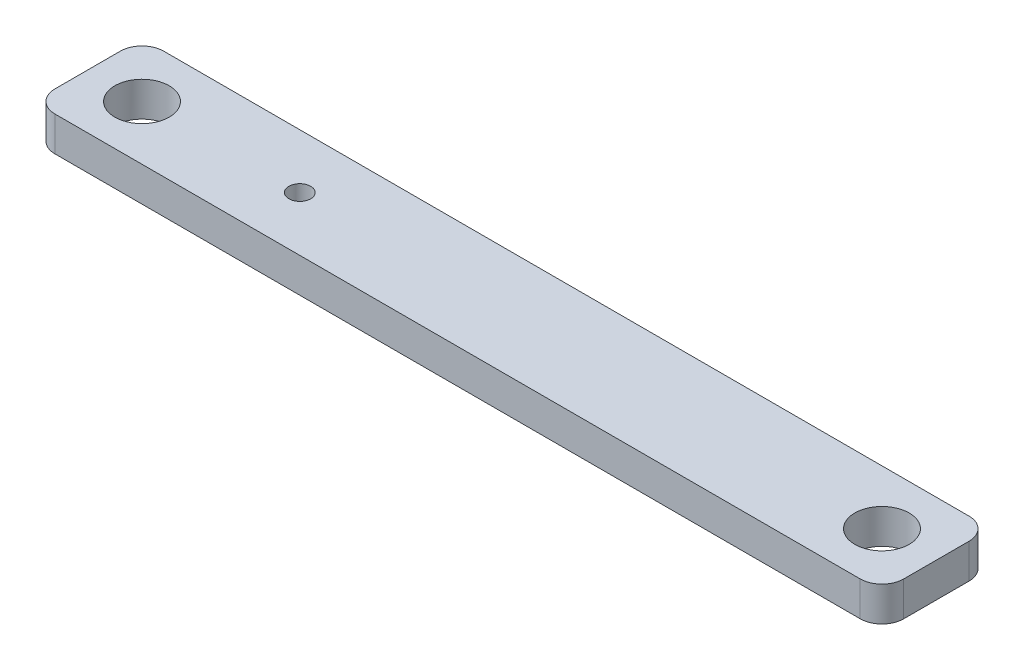
ISO-10303-21;
HEADER;
FILE_DESCRIPTION(('STEP AP214'),'2;1');
FILE_NAME('part.step','',(''),(''),'','','');
FILE_SCHEMA(('AUTOMOTIVE_DESIGN { 1 0 10303 214 1 1 1 1 }'));
ENDSEC;
DATA;
#1=APPLICATION_CONTEXT('core data for automotive mechanical design processes');
#2=APPLICATION_PROTOCOL_DEFINITION('international standard','automotive_design',2000,#1);
#3=PRODUCT_CONTEXT('',#1,'mechanical');
#4=PRODUCT('Part','Part','',(#3));
#5=PRODUCT_RELATED_PRODUCT_CATEGORY('part','',(#4));
#6=PRODUCT_DEFINITION_FORMATION('','',#4);
#7=PRODUCT_DEFINITION_CONTEXT('part definition',#1,'design');
#8=PRODUCT_DEFINITION('design','',#6,#7);
#9=PRODUCT_DEFINITION_SHAPE('','',#8);
#10=(LENGTH_UNIT() NAMED_UNIT(*) SI_UNIT(.MILLI.,.METRE.));
#11=(NAMED_UNIT(*) PLANE_ANGLE_UNIT() SI_UNIT($,.RADIAN.));
#12=(NAMED_UNIT(*) SI_UNIT($,.STERADIAN.) SOLID_ANGLE_UNIT());
#13=UNCERTAINTY_MEASURE_WITH_UNIT(LENGTH_MEASURE(1.E-05),#10,'distance_accuracy_value','');
#14=(GEOMETRIC_REPRESENTATION_CONTEXT(3) GLOBAL_UNCERTAINTY_ASSIGNED_CONTEXT((#13)) GLOBAL_UNIT_ASSIGNED_CONTEXT((#10,
#11,#12)) REPRESENTATION_CONTEXT('',''));
#15=CARTESIAN_POINT('',(0.,0.,0.));
#16=DIRECTION('',(0.,0.,1.));
#17=DIRECTION('',(1.,0.,0.));
#18=AXIS2_PLACEMENT_3D('',#15,#16,#17);
#19=CARTESIAN_POINT('',(39.,3.175,5.));
#20=DIRECTION('',(-1.,0.,0.));
#21=DIRECTION('',(0.,0.,1.));
#22=AXIS2_PLACEMENT_3D('',#19,#20,#21);
#23=PLANE('',#22);
#24=DIRECTION('',(0.,0.,-1.));
#25=VECTOR('',#24,1.);
#26=CARTESIAN_POINT('',(39.,3.175,5.));
#27=LINE('',#26,#25);
#28=CARTESIAN_POINT('',(39.,3.175,3.));
#29=VERTEX_POINT('',#28);
#30=CARTESIAN_POINT('',(39.,3.175,-3.));
#31=VERTEX_POINT('',#30);
#32=EDGE_CURVE('E131',#29,#31,#27,.T.);
#33=ORIENTED_EDGE('',*,*,#32,.F.);
#34=DIRECTION('',(0.,-1.,0.));
#35=VECTOR('',#34,1.);
#36=CARTESIAN_POINT('',(39.,3.175,3.));
#37=LINE('',#36,#35);
#38=CARTESIAN_POINT('',(39.,0.,3.));
#39=VERTEX_POINT('',#38);
#40=EDGE_CURVE('E115',#29,#39,#37,.T.);
#41=ORIENTED_EDGE('',*,*,#40,.T.);
#42=DIRECTION('',(0.,0.,-1.));
#43=VECTOR('',#42,1.);
#44=CARTESIAN_POINT('',(39.,0.,5.));
#45=LINE('',#44,#43);
#46=CARTESIAN_POINT('',(39.,0.,-3.));
#47=VERTEX_POINT('',#46);
#48=EDGE_CURVE('E128',#39,#47,#45,.T.);
#49=ORIENTED_EDGE('',*,*,#48,.T.);
#50=DIRECTION('',(0.,-1.,0.));
#51=VECTOR('',#50,1.);
#52=CARTESIAN_POINT('',(39.,3.175,-3.));
#53=LINE('',#52,#51);
#54=EDGE_CURVE('E134',#47,#31,#53,.F.);
#55=ORIENTED_EDGE('',*,*,#54,.T.);
#56=EDGE_LOOP('',(#33,#41,#49,#55));
#57=FACE_BOUND('',#56,.T.);
#58=ADVANCED_FACE('F44',(#57),#23,.F.);
#59=CARTESIAN_POINT('',(-39.,3.175,-5.));
#60=DIRECTION('',(0.,0.,1.));
#61=DIRECTION('',(1.,0.,0.));
#62=AXIS2_PLACEMENT_3D('',#59,#60,#61);
#63=PLANE('',#62);
#64=DIRECTION('',(-1.,0.,0.));
#65=VECTOR('',#64,1.);
#66=CARTESIAN_POINT('',(-39.,3.175,-5.));
#67=LINE('',#66,#65);
#68=CARTESIAN_POINT('',(37.,3.175,-5.));
#69=VERTEX_POINT('',#68);
#70=CARTESIAN_POINT('',(-37.,3.175,-5.));
#71=VERTEX_POINT('',#70);
#72=EDGE_CURVE('E196',#69,#71,#67,.T.);
#73=ORIENTED_EDGE('',*,*,#72,.F.);
#74=DIRECTION('',(0.,-1.,0.));
#75=VECTOR('',#74,1.);
#76=CARTESIAN_POINT('',(37.,3.175,-5.));
#77=LINE('',#76,#75);
#78=CARTESIAN_POINT('',(37.,0.,-5.));
#79=VERTEX_POINT('',#78);
#80=EDGE_CURVE('E187',#69,#79,#77,.T.);
#81=ORIENTED_EDGE('',*,*,#80,.T.);
#82=DIRECTION('',(-1.,0.,0.));
#83=VECTOR('',#82,1.);
#84=CARTESIAN_POINT('',(-39.,0.,-5.));
#85=LINE('',#84,#83);
#86=CARTESIAN_POINT('',(-37.,0.,-5.));
#87=VERTEX_POINT('',#86);
#88=EDGE_CURVE('E139',#79,#87,#85,.T.);
#89=ORIENTED_EDGE('',*,*,#88,.T.);
#90=DIRECTION('',(0.,-1.,0.));
#91=VECTOR('',#90,1.);
#92=CARTESIAN_POINT('',(-37.,3.175,-5.));
#93=LINE('',#92,#91);
#94=EDGE_CURVE('E184',#87,#71,#93,.F.);
#95=ORIENTED_EDGE('',*,*,#94,.T.);
#96=EDGE_LOOP('',(#73,#81,#89,#95));
#97=FACE_BOUND('',#96,.T.);
#98=ADVANCED_FACE('F245',(#97),#63,.F.);
#99=CARTESIAN_POINT('',(-39.,3.175,5.));
#100=DIRECTION('',(1.,0.,0.));
#101=DIRECTION('',(0.,0.,-1.));
#102=AXIS2_PLACEMENT_3D('',#99,#100,#101);
#103=PLANE('',#102);
#104=DIRECTION('',(0.,0.,1.));
#105=VECTOR('',#104,1.);
#106=CARTESIAN_POINT('',(-39.,3.175,5.));
#107=LINE('',#106,#105);
#108=CARTESIAN_POINT('',(-39.,3.175,-3.));
#109=VERTEX_POINT('',#108);
#110=CARTESIAN_POINT('',(-39.,3.175,3.));
#111=VERTEX_POINT('',#110);
#112=EDGE_CURVE('E194',#109,#111,#107,.T.);
#113=ORIENTED_EDGE('',*,*,#112,.F.);
#114=DIRECTION('',(0.,-1.,0.));
#115=VECTOR('',#114,1.);
#116=CARTESIAN_POINT('',(-39.,3.175,-3.));
#117=LINE('',#116,#115);
#118=CARTESIAN_POINT('',(-39.,0.,-3.));
#119=VERTEX_POINT('',#118);
#120=EDGE_CURVE('E11',#109,#119,#117,.T.);
#121=ORIENTED_EDGE('',*,*,#120,.T.);
#122=DIRECTION('',(0.,0.,1.));
#123=VECTOR('',#122,1.);
#124=CARTESIAN_POINT('',(-39.,0.,5.));
#125=LINE('',#124,#123);
#126=CARTESIAN_POINT('',(-39.,0.,3.));
#127=VERTEX_POINT('',#126);
#128=EDGE_CURVE('E145',#119,#127,#125,.T.);
#129=ORIENTED_EDGE('',*,*,#128,.T.);
#130=DIRECTION('',(0.,-1.,0.));
#131=VECTOR('',#130,1.);
#132=CARTESIAN_POINT('',(-39.,3.175,3.));
#133=LINE('',#132,#131);
#134=EDGE_CURVE('E53',#127,#111,#133,.F.);
#135=ORIENTED_EDGE('',*,*,#134,.T.);
#136=EDGE_LOOP('',(#113,#121,#129,#135));
#137=FACE_BOUND('',#136,.T.);
#138=ADVANCED_FACE('F238',(#137),#103,.F.);
#139=CARTESIAN_POINT('',(-39.,3.175,5.));
#140=DIRECTION('',(0.,0.,-1.));
#141=DIRECTION('',(-1.,0.,0.));
#142=AXIS2_PLACEMENT_3D('',#139,#140,#141);
#143=PLANE('',#142);
#144=DIRECTION('',(1.,0.,0.));
#145=VECTOR('',#144,1.);
#146=CARTESIAN_POINT('',(-39.,0.,5.));
#147=LINE('',#146,#145);
#148=CARTESIAN_POINT('',(-37.,0.,5.));
#149=VERTEX_POINT('',#148);
#150=CARTESIAN_POINT('',(37.,0.,5.));
#151=VERTEX_POINT('',#150);
#152=EDGE_CURVE('E156',#149,#151,#147,.T.);
#153=ORIENTED_EDGE('',*,*,#152,.T.);
#154=DIRECTION('',(0.,-1.,0.));
#155=VECTOR('',#154,1.);
#156=CARTESIAN_POINT('',(37.,3.175,5.));
#157=LINE('',#156,#155);
#158=CARTESIAN_POINT('',(37.,3.175,5.));
#159=VERTEX_POINT('',#158);
#160=EDGE_CURVE('E116',#151,#159,#157,.F.);
#161=ORIENTED_EDGE('',*,*,#160,.T.);
#162=DIRECTION('',(1.,0.,0.));
#163=VECTOR('',#162,1.);
#164=CARTESIAN_POINT('',(-39.,3.175,5.));
#165=LINE('',#164,#163);
#166=CARTESIAN_POINT('',(-37.,3.175,5.));
#167=VERTEX_POINT('',#166);
#168=EDGE_CURVE('E151',#167,#159,#165,.T.);
#169=ORIENTED_EDGE('',*,*,#168,.F.);
#170=DIRECTION('',(0.,-1.,0.));
#171=VECTOR('',#170,1.);
#172=CARTESIAN_POINT('',(-37.,3.175,5.));
#173=LINE('',#172,#171);
#174=EDGE_CURVE('E122',#167,#149,#173,.T.);
#175=ORIENTED_EDGE('',*,*,#174,.T.);
#176=EDGE_LOOP('',(#153,#161,#169,#175));
#177=FACE_BOUND('',#176,.T.);
#178=ADVANCED_FACE('F227',(#177),#143,.F.);
#179=CARTESIAN_POINT('',(0.,3.175,0.));
#180=DIRECTION('',(0.,-1.,0.));
#181=DIRECTION('',(0.,0.,-1.));
#182=AXIS2_PLACEMENT_3D('',#179,#180,#181);
#183=PLANE('',#182);
#184=CARTESIAN_POINT('',(-19.5,3.175,0.));
#185=DIRECTION('',(0.,1.,0.));
#186=DIRECTION('',(0.,0.,1.));
#187=AXIS2_PLACEMENT_3D('',#184,#185,#186);
#188=CIRCLE('',#187,1.);
#189=CARTESIAN_POINT('',(-19.5,3.175,1.));
#190=VERTEX_POINT('',#189);
#191=EDGE_CURVE('E209',#190,#190,#188,.T.);
#192=ORIENTED_EDGE('',*,*,#191,.F.);
#193=EDGE_LOOP('',(#192));
#194=FACE_BOUND('',#193,.T.);
#195=CARTESIAN_POINT('',(-34.,3.175,0.));
#196=DIRECTION('',(0.,1.,0.));
#197=DIRECTION('',(0.,0.,1.));
#198=AXIS2_PLACEMENT_3D('',#195,#196,#197);
#199=CIRCLE('',#198,2.5);
#200=CARTESIAN_POINT('',(-34.,3.175,2.5));
#201=VERTEX_POINT('',#200);
#202=EDGE_CURVE('E148',#201,#201,#199,.T.);
#203=ORIENTED_EDGE('',*,*,#202,.F.);
#204=EDGE_LOOP('',(#203));
#205=FACE_BOUND('',#204,.T.);
#206=CARTESIAN_POINT('',(34.,3.175,0.));
#207=DIRECTION('',(0.,1.,0.));
#208=DIRECTION('',(0.,0.,-1.));
#209=AXIS2_PLACEMENT_3D('',#206,#207,#208);
#210=CIRCLE('',#209,2.5);
#211=CARTESIAN_POINT('',(34.,3.175,-2.50000000000001));
#212=VERTEX_POINT('',#211);
#213=EDGE_CURVE('E202',#212,#212,#210,.T.);
#214=ORIENTED_EDGE('',*,*,#213,.F.);
#215=EDGE_LOOP('',(#214));
#216=FACE_BOUND('',#215,.T.);
#217=ORIENTED_EDGE('',*,*,#168,.T.);
#218=CARTESIAN_POINT('',(37.,3.175,3.));
#219=DIRECTION('',(0.,-1.,0.));
#220=DIRECTION('',(0.,0.,-1.));
#221=AXIS2_PLACEMENT_3D('',#218,#219,#220);
#222=CIRCLE('',#221,2.);
#223=EDGE_CURVE('E181',#159,#29,#222,.F.);
#224=ORIENTED_EDGE('',*,*,#223,.T.);
#225=ORIENTED_EDGE('',*,*,#32,.T.);
#226=CARTESIAN_POINT('',(37.,3.175,-3.));
#227=DIRECTION('',(0.,-1.,0.));
#228=DIRECTION('',(0.,0.,-1.));
#229=AXIS2_PLACEMENT_3D('',#226,#227,#228);
#230=CIRCLE('',#229,2.);
#231=EDGE_CURVE('E178',#31,#69,#230,.F.);
#232=ORIENTED_EDGE('',*,*,#231,.T.);
#233=ORIENTED_EDGE('',*,*,#72,.T.);
#234=CARTESIAN_POINT('',(-37.,3.175,-3.));
#235=DIRECTION('',(0.,-1.,0.));
#236=DIRECTION('',(0.,0.,-1.));
#237=AXIS2_PLACEMENT_3D('',#234,#235,#236);
#238=CIRCLE('',#237,2.);
#239=EDGE_CURVE('E66',#71,#109,#238,.F.);
#240=ORIENTED_EDGE('',*,*,#239,.T.);
#241=ORIENTED_EDGE('',*,*,#112,.T.);
#242=CARTESIAN_POINT('',(-37.,3.175,3.));
#243=DIRECTION('',(0.,-1.,0.));
#244=DIRECTION('',(0.,0.,-1.));
#245=AXIS2_PLACEMENT_3D('',#242,#243,#244);
#246=CIRCLE('',#245,2.);
#247=EDGE_CURVE('E173',#111,#167,#246,.F.);
#248=ORIENTED_EDGE('',*,*,#247,.T.);
#249=EDGE_LOOP('',(#217,#224,#225,#232,#233,#240,#241,#248));
#250=FACE_BOUND('',#249,.T.);
#251=ADVANCED_FACE('F224',(#194,#205,#216,#250),#183,.F.);
#252=CARTESIAN_POINT('',(0.,0.,0.));
#253=DIRECTION('',(0.,-1.,0.));
#254=DIRECTION('',(0.,0.,-1.));
#255=AXIS2_PLACEMENT_3D('',#252,#253,#254);
#256=PLANE('',#255);
#257=CARTESIAN_POINT('',(-19.5,0.,0.));
#258=DIRECTION('',(0.,-1.,0.));
#259=DIRECTION('',(0.,0.,-1.));
#260=AXIS2_PLACEMENT_3D('',#257,#258,#259);
#261=CIRCLE('',#260,1.);
#262=CARTESIAN_POINT('',(-19.5,0.,-1.));
#263=VERTEX_POINT('',#262);
#264=EDGE_CURVE('E214',#263,#263,#261,.F.);
#265=ORIENTED_EDGE('',*,*,#264,.T.);
#266=EDGE_LOOP('',(#265));
#267=FACE_BOUND('',#266,.T.);
#268=CARTESIAN_POINT('',(-34.,0.,0.));
#269=DIRECTION('',(0.,-1.,0.));
#270=DIRECTION('',(0.,0.,-1.));
#271=AXIS2_PLACEMENT_3D('',#268,#269,#270);
#272=CIRCLE('',#271,2.5);
#273=CARTESIAN_POINT('',(-34.,0.,-2.5));
#274=VERTEX_POINT('',#273);
#275=EDGE_CURVE('E140',#274,#274,#272,.F.);
#276=ORIENTED_EDGE('',*,*,#275,.T.);
#277=EDGE_LOOP('',(#276));
#278=FACE_BOUND('',#277,.T.);
#279=CARTESIAN_POINT('',(34.,0.,0.));
#280=DIRECTION('',(0.,-1.,0.));
#281=DIRECTION('',(0.,0.,-1.));
#282=AXIS2_PLACEMENT_3D('',#279,#280,#281);
#283=CIRCLE('',#282,2.5);
#284=CARTESIAN_POINT('',(34.,0.,-2.50000000000001));
#285=VERTEX_POINT('',#284);
#286=EDGE_CURVE('E206',#285,#285,#283,.F.);
#287=ORIENTED_EDGE('',*,*,#286,.T.);
#288=EDGE_LOOP('',(#287));
#289=FACE_BOUND('',#288,.T.);
#290=ORIENTED_EDGE('',*,*,#48,.F.);
#291=CARTESIAN_POINT('',(37.,0.,3.));
#292=DIRECTION('',(0.,-1.,0.));
#293=DIRECTION('',(0.,0.,-1.));
#294=AXIS2_PLACEMENT_3D('',#291,#292,#293);
#295=CIRCLE('',#294,2.);
#296=EDGE_CURVE('E111',#39,#151,#295,.T.);
#297=ORIENTED_EDGE('',*,*,#296,.T.);
#298=ORIENTED_EDGE('',*,*,#152,.F.);
#299=CARTESIAN_POINT('',(-37.,0.,3.));
#300=DIRECTION('',(0.,-1.,0.));
#301=DIRECTION('',(0.,0.,-1.));
#302=AXIS2_PLACEMENT_3D('',#299,#300,#301);
#303=CIRCLE('',#302,2.);
#304=EDGE_CURVE('E133',#149,#127,#303,.T.);
#305=ORIENTED_EDGE('',*,*,#304,.T.);
#306=ORIENTED_EDGE('',*,*,#128,.F.);
#307=CARTESIAN_POINT('',(-37.,0.,-3.));
#308=DIRECTION('',(0.,-1.,0.));
#309=DIRECTION('',(0.,0.,-1.));
#310=AXIS2_PLACEMENT_3D('',#307,#308,#309);
#311=CIRCLE('',#310,2.);
#312=EDGE_CURVE('E163',#119,#87,#311,.T.);
#313=ORIENTED_EDGE('',*,*,#312,.T.);
#314=ORIENTED_EDGE('',*,*,#88,.F.);
#315=CARTESIAN_POINT('',(37.,0.,-3.));
#316=DIRECTION('',(0.,-1.,0.));
#317=DIRECTION('',(0.,0.,-1.));
#318=AXIS2_PLACEMENT_3D('',#315,#316,#317);
#319=CIRCLE('',#318,2.);
#320=EDGE_CURVE('E123',#79,#47,#319,.T.);
#321=ORIENTED_EDGE('',*,*,#320,.T.);
#322=EDGE_LOOP('',(#290,#297,#298,#305,#306,#313,#314,#321));
#323=FACE_BOUND('',#322,.T.);
#324=ADVANCED_FACE('F136',(#267,#278,#289,#323),#256,.T.);
#325=CARTESIAN_POINT('',(34.,-7.07106781186548,0.));
#326=DIRECTION('',(0.,1.,0.));
#327=DIRECTION('',(0.,0.,1.));
#328=AXIS2_PLACEMENT_3D('',#325,#326,#327);
#329=CYLINDRICAL_SURFACE('',#328,2.5);
#330=ORIENTED_EDGE('',*,*,#213,.T.);
#331=EDGE_LOOP('',(#330));
#332=FACE_BOUND('',#331,.T.);
#333=ORIENTED_EDGE('',*,*,#286,.F.);
#334=EDGE_LOOP('',(#333));
#335=FACE_BOUND('',#334,.T.);
#336=ADVANCED_FACE('F269',(#332,#335),#329,.F.);
#337=CARTESIAN_POINT('',(-34.,-7.07106781186548,0.));
#338=DIRECTION('',(0.,1.,0.));
#339=DIRECTION('',(0.,0.,1.));
#340=AXIS2_PLACEMENT_3D('',#337,#338,#339);
#341=CYLINDRICAL_SURFACE('',#340,2.5);
#342=ORIENTED_EDGE('',*,*,#202,.T.);
#343=EDGE_LOOP('',(#342));
#344=FACE_BOUND('',#343,.T.);
#345=ORIENTED_EDGE('',*,*,#275,.F.);
#346=EDGE_LOOP('',(#345));
#347=FACE_BOUND('',#346,.T.);
#348=ADVANCED_FACE('F274',(#344,#347),#341,.F.);
#349=CARTESIAN_POINT('',(-19.5,-0.00100000000000013,0.));
#350=DIRECTION('',(0.,1.,0.));
#351=DIRECTION('',(0.,0.,1.));
#352=AXIS2_PLACEMENT_3D('',#349,#350,#351);
#353=CYLINDRICAL_SURFACE('',#352,1.);
#354=ORIENTED_EDGE('',*,*,#264,.F.);
#355=EDGE_LOOP('',(#354));
#356=FACE_BOUND('',#355,.T.);
#357=ORIENTED_EDGE('',*,*,#191,.T.);
#358=EDGE_LOOP('',(#357));
#359=FACE_BOUND('',#358,.T.);
#360=ADVANCED_FACE('F222',(#356,#359),#353,.F.);
#361=CARTESIAN_POINT('',(37.,3.175,3.));
#362=DIRECTION('',(0.,-1.,0.));
#363=DIRECTION('',(0.,0.,-1.));
#364=AXIS2_PLACEMENT_3D('',#361,#362,#363);
#365=CYLINDRICAL_SURFACE('',#364,2.);
#366=ORIENTED_EDGE('',*,*,#223,.F.);
#367=ORIENTED_EDGE('',*,*,#160,.F.);
#368=ORIENTED_EDGE('',*,*,#296,.F.);
#369=ORIENTED_EDGE('',*,*,#40,.F.);
#370=EDGE_LOOP('',(#366,#367,#368,#369));
#371=FACE_BOUND('',#370,.T.);
#372=ADVANCED_FACE('F114',(#371),#365,.T.);
#373=CARTESIAN_POINT('',(37.,3.175,-3.));
#374=DIRECTION('',(0.,-1.,0.));
#375=DIRECTION('',(0.,0.,-1.));
#376=AXIS2_PLACEMENT_3D('',#373,#374,#375);
#377=CYLINDRICAL_SURFACE('',#376,2.);
#378=ORIENTED_EDGE('',*,*,#231,.F.);
#379=ORIENTED_EDGE('',*,*,#54,.F.);
#380=ORIENTED_EDGE('',*,*,#320,.F.);
#381=ORIENTED_EDGE('',*,*,#80,.F.);
#382=EDGE_LOOP('',(#378,#379,#380,#381));
#383=FACE_BOUND('',#382,.T.);
#384=ADVANCED_FACE('F248',(#383),#377,.T.);
#385=CARTESIAN_POINT('',(-37.,3.175,-3.));
#386=DIRECTION('',(0.,-1.,0.));
#387=DIRECTION('',(0.,0.,-1.));
#388=AXIS2_PLACEMENT_3D('',#385,#386,#387);
#389=CYLINDRICAL_SURFACE('',#388,2.);
#390=ORIENTED_EDGE('',*,*,#239,.F.);
#391=ORIENTED_EDGE('',*,*,#94,.F.);
#392=ORIENTED_EDGE('',*,*,#312,.F.);
#393=ORIENTED_EDGE('',*,*,#120,.F.);
#394=EDGE_LOOP('',(#390,#391,#392,#393));
#395=FACE_BOUND('',#394,.T.);
#396=ADVANCED_FACE('F241',(#395),#389,.T.);
#397=CARTESIAN_POINT('',(-37.,3.175,3.));
#398=DIRECTION('',(0.,-1.,0.));
#399=DIRECTION('',(0.,0.,-1.));
#400=AXIS2_PLACEMENT_3D('',#397,#398,#399);
#401=CYLINDRICAL_SURFACE('',#400,2.);
#402=ORIENTED_EDGE('',*,*,#247,.F.);
#403=ORIENTED_EDGE('',*,*,#134,.F.);
#404=ORIENTED_EDGE('',*,*,#304,.F.);
#405=ORIENTED_EDGE('',*,*,#174,.F.);
#406=EDGE_LOOP('',(#402,#403,#404,#405));
#407=FACE_BOUND('',#406,.T.);
#408=ADVANCED_FACE('F46',(#407),#401,.T.);
#409=CLOSED_SHELL('',(#58,#98,#138,#178,#251,#324,#336,#348,#360,#372,#384,#396,#408));
#410=MANIFOLD_SOLID_BREP('B2',#409);
#411=ADVANCED_BREP_SHAPE_REPRESENTATION('',(#18,#410),#14);
#412=SHAPE_DEFINITION_REPRESENTATION(#9,#411);
ENDSEC;
END-ISO-10303-21;
